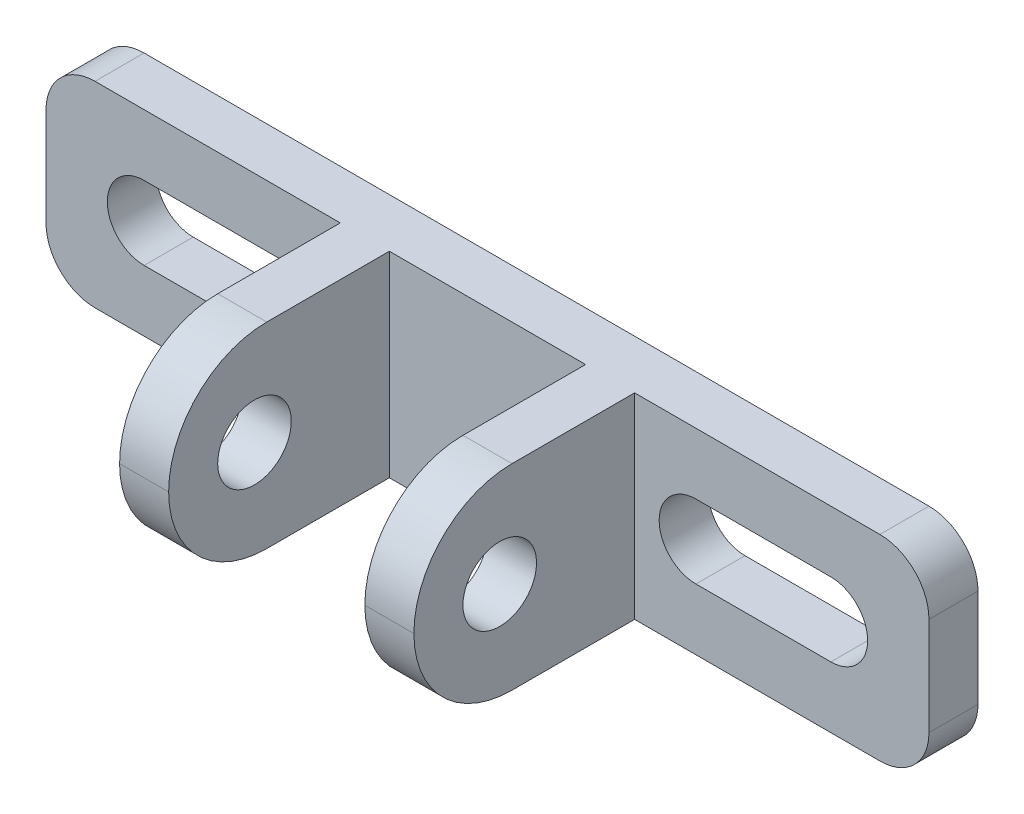
ISO-10303-21;
HEADER;
FILE_DESCRIPTION(('STEP AP214'),'2;1');
FILE_NAME('part.step','',(''),(''),'','','');
FILE_SCHEMA(('AUTOMOTIVE_DESIGN { 1 0 10303 214 1 1 1 1 }'));
ENDSEC;
DATA;
#1=APPLICATION_CONTEXT('core data for automotive mechanical design processes');
#2=APPLICATION_PROTOCOL_DEFINITION('international standard','automotive_design',2000,#1);
#3=PRODUCT_CONTEXT('',#1,'mechanical');
#4=PRODUCT('Part','Part','',(#3));
#5=PRODUCT_RELATED_PRODUCT_CATEGORY('part','',(#4));
#6=PRODUCT_DEFINITION_FORMATION('','',#4);
#7=PRODUCT_DEFINITION_CONTEXT('part definition',#1,'design');
#8=PRODUCT_DEFINITION('design','',#6,#7);
#9=PRODUCT_DEFINITION_SHAPE('','',#8);
#10=(LENGTH_UNIT() NAMED_UNIT(*) SI_UNIT(.MILLI.,.METRE.));
#11=(NAMED_UNIT(*) PLANE_ANGLE_UNIT() SI_UNIT($,.RADIAN.));
#12=(NAMED_UNIT(*) SI_UNIT($,.STERADIAN.) SOLID_ANGLE_UNIT());
#13=UNCERTAINTY_MEASURE_WITH_UNIT(LENGTH_MEASURE(1.E-05),#10,'distance_accuracy_value','');
#14=(GEOMETRIC_REPRESENTATION_CONTEXT(3) GLOBAL_UNCERTAINTY_ASSIGNED_CONTEXT((#13)) GLOBAL_UNIT_ASSIGNED_CONTEXT((#10,
#11,#12)) REPRESENTATION_CONTEXT('',''));
#15=CARTESIAN_POINT('',(0.,0.,0.));
#16=DIRECTION('',(0.,0.,1.));
#17=DIRECTION('',(1.,0.,0.));
#18=AXIS2_PLACEMENT_3D('',#15,#16,#17);
#19=CARTESIAN_POINT('',(36.,0.,11.));
#20=DIRECTION('',(1.,0.,0.));
#21=DIRECTION('',(0.,0.,-1.));
#22=AXIS2_PLACEMENT_3D('',#19,#20,#21);
#23=PLANE('',#22);
#24=DIRECTION('',(0.,-1.,0.));
#25=VECTOR('',#24,1.);
#26=CARTESIAN_POINT('',(36.,0.,0.));
#27=LINE('',#26,#25);
#28=CARTESIAN_POINT('',(36.,-2.,0.));
#29=VERTEX_POINT('',#28);
#30=CARTESIAN_POINT('',(36.,-6.,0.));
#31=VERTEX_POINT('',#30);
#32=EDGE_CURVE('E345',#29,#31,#27,.T.);
#33=ORIENTED_EDGE('',*,*,#32,.F.);
#34=DIRECTION('',(0.,0.,-1.));
#35=VECTOR('',#34,1.);
#36=CARTESIAN_POINT('',(36.,-2.,11.));
#37=LINE('',#36,#35);
#38=CARTESIAN_POINT('',(36.,-2.,2.));
#39=VERTEX_POINT('',#38);
#40=EDGE_CURVE('E402',#29,#39,#37,.F.);
#41=ORIENTED_EDGE('',*,*,#40,.T.);
#42=DIRECTION('',(0.,1.,0.));
#43=VECTOR('',#42,1.);
#44=CARTESIAN_POINT('',(36.,-8.,2.));
#45=LINE('',#44,#43);
#46=CARTESIAN_POINT('',(36.,-6.,2.));
#47=VERTEX_POINT('',#46);
#48=EDGE_CURVE('E292',#47,#39,#45,.T.);
#49=ORIENTED_EDGE('',*,*,#48,.F.);
#50=DIRECTION('',(0.,0.,-1.));
#51=VECTOR('',#50,1.);
#52=CARTESIAN_POINT('',(36.,-6.,0.));
#53=LINE('',#52,#51);
#54=EDGE_CURVE('E399',#47,#31,#53,.T.);
#55=ORIENTED_EDGE('',*,*,#54,.T.);
#56=EDGE_LOOP('',(#33,#41,#49,#55));
#57=FACE_BOUND('',#56,.T.);
#58=ADVANCED_FACE('F36',(#57),#23,.T.);
#59=CARTESIAN_POINT('',(0.,-8.,11.));
#60=DIRECTION('',(0.,1.,0.));
#61=DIRECTION('',(0.,0.,1.));
#62=AXIS2_PLACEMENT_3D('',#59,#60,#61);
#63=PLANE('',#62);
#64=DIRECTION('',(1.,0.,0.));
#65=VECTOR('',#64,1.);
#66=CARTESIAN_POINT('',(0.,-8.,0.));
#67=LINE('',#66,#65);
#68=CARTESIAN_POINT('',(2.,-8.,0.));
#69=VERTEX_POINT('',#68);
#70=CARTESIAN_POINT('',(34.,-8.,0.));
#71=VERTEX_POINT('',#70);
#72=EDGE_CURVE('E299',#69,#71,#67,.T.);
#73=ORIENTED_EDGE('',*,*,#72,.T.);
#74=DIRECTION('',(0.,0.,-1.));
#75=VECTOR('',#74,1.);
#76=CARTESIAN_POINT('',(34.,-8.,2.));
#77=LINE('',#76,#75);
#78=CARTESIAN_POINT('',(34.,-8.,2.));
#79=VERTEX_POINT('',#78);
#80=EDGE_CURVE('E411',#71,#79,#77,.F.);
#81=ORIENTED_EDGE('',*,*,#80,.T.);
#82=DIRECTION('',(1.,0.,0.));
#83=VECTOR('',#82,1.);
#84=CARTESIAN_POINT('',(24.,-8.,2.));
#85=LINE('',#84,#83);
#86=CARTESIAN_POINT('',(24.,-8.,2.));
#87=VERTEX_POINT('',#86);
#88=EDGE_CURVE('E289',#87,#79,#85,.T.);
#89=ORIENTED_EDGE('',*,*,#88,.F.);
#90=DIRECTION('',(0.,0.,1.));
#91=VECTOR('',#90,1.);
#92=CARTESIAN_POINT('',(24.,-8.,2.));
#93=LINE('',#92,#91);
#94=CARTESIAN_POINT('',(24.,-8.,7.));
#95=VERTEX_POINT('',#94);
#96=EDGE_CURVE('E296',#87,#95,#93,.T.);
#97=ORIENTED_EDGE('',*,*,#96,.T.);
#98=DIRECTION('',(1.,0.,0.));
#99=VECTOR('',#98,1.);
#100=CARTESIAN_POINT('',(0.,-8.,7.));
#101=LINE('',#100,#99);
#102=CARTESIAN_POINT('',(22.,-8.,7.));
#103=VERTEX_POINT('',#102);
#104=EDGE_CURVE('E360',#95,#103,#101,.F.);
#105=ORIENTED_EDGE('',*,*,#104,.T.);
#106=DIRECTION('',(0.,0.,1.));
#107=VECTOR('',#106,1.);
#108=CARTESIAN_POINT('',(22.,-8.,2.));
#109=LINE('',#108,#107);
#110=CARTESIAN_POINT('',(22.,-8.,2.));
#111=VERTEX_POINT('',#110);
#112=EDGE_CURVE('E306',#111,#103,#109,.T.);
#113=ORIENTED_EDGE('',*,*,#112,.F.);
#114=DIRECTION('',(1.,0.,0.));
#115=VECTOR('',#114,1.);
#116=CARTESIAN_POINT('',(14.,-8.,2.));
#117=LINE('',#116,#115);
#118=CARTESIAN_POINT('',(14.,-8.,2.));
#119=VERTEX_POINT('',#118);
#120=EDGE_CURVE('E329',#119,#111,#117,.T.);
#121=ORIENTED_EDGE('',*,*,#120,.F.);
#122=DIRECTION('',(0.,0.,1.));
#123=VECTOR('',#122,1.);
#124=CARTESIAN_POINT('',(14.,-8.,2.));
#125=LINE('',#124,#123);
#126=CARTESIAN_POINT('',(14.,-8.,7.));
#127=VERTEX_POINT('',#126);
#128=EDGE_CURVE('E335',#119,#127,#125,.T.);
#129=ORIENTED_EDGE('',*,*,#128,.T.);
#130=DIRECTION('',(1.,0.,0.));
#131=VECTOR('',#130,1.);
#132=CARTESIAN_POINT('',(0.,-8.,7.));
#133=LINE('',#132,#131);
#134=CARTESIAN_POINT('',(12.,-8.,7.));
#135=VERTEX_POINT('',#134);
#136=EDGE_CURVE('E358',#127,#135,#133,.F.);
#137=ORIENTED_EDGE('',*,*,#136,.T.);
#138=DIRECTION('',(0.,0.,1.));
#139=VECTOR('',#138,1.);
#140=CARTESIAN_POINT('',(12.,-8.,2.));
#141=LINE('',#140,#139);
#142=CARTESIAN_POINT('',(12.,-8.,2.));
#143=VERTEX_POINT('',#142);
#144=EDGE_CURVE('E314',#143,#135,#141,.T.);
#145=ORIENTED_EDGE('',*,*,#144,.F.);
#146=DIRECTION('',(1.,0.,0.));
#147=VECTOR('',#146,1.);
#148=CARTESIAN_POINT('',(12.,-8.,2.));
#149=LINE('',#148,#147);
#150=CARTESIAN_POINT('',(2.,-8.,2.));
#151=VERTEX_POINT('',#150);
#152=EDGE_CURVE('E309',#151,#143,#149,.T.);
#153=ORIENTED_EDGE('',*,*,#152,.F.);
#154=DIRECTION('',(0.,0.,-1.));
#155=VECTOR('',#154,1.);
#156=CARTESIAN_POINT('',(2.,-8.,11.));
#157=LINE('',#156,#155);
#158=EDGE_CURVE('E408',#151,#69,#157,.T.);
#159=ORIENTED_EDGE('',*,*,#158,.T.);
#160=EDGE_LOOP('',(#73,#81,#89,#97,#105,#113,#121,#129,#137,#145,#153,#159));
#161=FACE_BOUND('',#160,.T.);
#162=ADVANCED_FACE('F452',(#161),#63,.F.);
#163=CARTESIAN_POINT('',(0.,0.,11.));
#164=DIRECTION('',(0.,1.,0.));
#165=DIRECTION('',(0.,0.,1.));
#166=AXIS2_PLACEMENT_3D('',#163,#164,#165);
#167=PLANE('',#166);
#168=DIRECTION('',(-1.,0.,0.));
#169=VECTOR('',#168,1.);
#170=CARTESIAN_POINT('',(36.,0.,2.));
#171=LINE('',#170,#169);
#172=CARTESIAN_POINT('',(34.,0.,2.));
#173=VERTEX_POINT('',#172);
#174=CARTESIAN_POINT('',(24.,0.,2.));
#175=VERTEX_POINT('',#174);
#176=EDGE_CURVE('E283',#173,#175,#171,.T.);
#177=ORIENTED_EDGE('',*,*,#176,.F.);
#178=DIRECTION('',(0.,0.,-1.));
#179=VECTOR('',#178,1.);
#180=CARTESIAN_POINT('',(34.,0.,11.));
#181=LINE('',#180,#179);
#182=CARTESIAN_POINT('',(34.,0.,0.));
#183=VERTEX_POINT('',#182);
#184=EDGE_CURVE('E388',#173,#183,#181,.T.);
#185=ORIENTED_EDGE('',*,*,#184,.T.);
#186=DIRECTION('',(1.,0.,0.));
#187=VECTOR('',#186,1.);
#188=CARTESIAN_POINT('',(0.,0.,0.));
#189=LINE('',#188,#187);
#190=CARTESIAN_POINT('',(2.,0.,0.));
#191=VERTEX_POINT('',#190);
#192=EDGE_CURVE('E348',#191,#183,#189,.T.);
#193=ORIENTED_EDGE('',*,*,#192,.F.);
#194=DIRECTION('',(0.,0.,-1.));
#195=VECTOR('',#194,1.);
#196=CARTESIAN_POINT('',(2.,0.,2.));
#197=LINE('',#196,#195);
#198=CARTESIAN_POINT('',(2.,0.,2.));
#199=VERTEX_POINT('',#198);
#200=EDGE_CURVE('E380',#191,#199,#197,.F.);
#201=ORIENTED_EDGE('',*,*,#200,.T.);
#202=DIRECTION('',(-1.,0.,0.));
#203=VECTOR('',#202,1.);
#204=CARTESIAN_POINT('',(0.,0.,2.));
#205=LINE('',#204,#203);
#206=CARTESIAN_POINT('',(12.,0.,2.));
#207=VERTEX_POINT('',#206);
#208=EDGE_CURVE('E302',#207,#199,#205,.T.);
#209=ORIENTED_EDGE('',*,*,#208,.F.);
#210=DIRECTION('',(0.,0.,1.));
#211=VECTOR('',#210,1.);
#212=CARTESIAN_POINT('',(12.,0.,2.));
#213=LINE('',#212,#211);
#214=CARTESIAN_POINT('',(12.,0.,7.));
#215=VERTEX_POINT('',#214);
#216=EDGE_CURVE('E286',#207,#215,#213,.T.);
#217=ORIENTED_EDGE('',*,*,#216,.T.);
#218=DIRECTION('',(1.,0.,0.));
#219=VECTOR('',#218,1.);
#220=CARTESIAN_POINT('',(14.,0.,7.));
#221=LINE('',#220,#219);
#222=CARTESIAN_POINT('',(14.,0.,7.));
#223=VERTEX_POINT('',#222);
#224=EDGE_CURVE('E367',#215,#223,#221,.T.);
#225=ORIENTED_EDGE('',*,*,#224,.T.);
#226=DIRECTION('',(0.,0.,1.));
#227=VECTOR('',#226,1.);
#228=CARTESIAN_POINT('',(14.,0.,2.));
#229=LINE('',#228,#227);
#230=CARTESIAN_POINT('',(14.,0.,2.));
#231=VERTEX_POINT('',#230);
#232=EDGE_CURVE('E338',#231,#223,#229,.T.);
#233=ORIENTED_EDGE('',*,*,#232,.F.);
#234=DIRECTION('',(-1.,0.,0.));
#235=VECTOR('',#234,1.);
#236=CARTESIAN_POINT('',(22.,0.,2.));
#237=LINE('',#236,#235);
#238=CARTESIAN_POINT('',(22.,0.,2.));
#239=VERTEX_POINT('',#238);
#240=EDGE_CURVE('E322',#239,#231,#237,.T.);
#241=ORIENTED_EDGE('',*,*,#240,.F.);
#242=DIRECTION('',(0.,0.,1.));
#243=VECTOR('',#242,1.);
#244=CARTESIAN_POINT('',(22.,0.,2.));
#245=LINE('',#244,#243);
#246=CARTESIAN_POINT('',(22.,0.,7.));
#247=VERTEX_POINT('',#246);
#248=EDGE_CURVE('E332',#239,#247,#245,.T.);
#249=ORIENTED_EDGE('',*,*,#248,.T.);
#250=DIRECTION('',(1.,0.,0.));
#251=VECTOR('',#250,1.);
#252=CARTESIAN_POINT('',(24.,0.,7.));
#253=LINE('',#252,#251);
#254=CARTESIAN_POINT('',(24.,0.,7.));
#255=VERTEX_POINT('',#254);
#256=EDGE_CURVE('E370',#247,#255,#253,.T.);
#257=ORIENTED_EDGE('',*,*,#256,.T.);
#258=DIRECTION('',(0.,0.,1.));
#259=VECTOR('',#258,1.);
#260=CARTESIAN_POINT('',(24.,0.,2.));
#261=LINE('',#260,#259);
#262=EDGE_CURVE('E295',#175,#255,#261,.T.);
#263=ORIENTED_EDGE('',*,*,#262,.F.);
#264=EDGE_LOOP('',(#177,#185,#193,#201,#209,#217,#225,#233,#241,#249,#257,#263));
#265=FACE_BOUND('',#264,.T.);
#266=ADVANCED_FACE('F435',(#265),#167,.T.);
#267=CARTESIAN_POINT('',(0.,0.,11.));
#268=DIRECTION('',(1.,0.,0.));
#269=DIRECTION('',(0.,1.,0.));
#270=AXIS2_PLACEMENT_3D('',#267,#268,#269);
#271=PLANE('',#270);
#272=DIRECTION('',(0.,-1.,0.));
#273=VECTOR('',#272,1.);
#274=CARTESIAN_POINT('',(0.,0.,0.));
#275=LINE('',#274,#273);
#276=CARTESIAN_POINT('',(0.,-2.,0.));
#277=VERTEX_POINT('',#276);
#278=CARTESIAN_POINT('',(0.,-6.,0.));
#279=VERTEX_POINT('',#278);
#280=EDGE_CURVE('E351',#277,#279,#275,.T.);
#281=ORIENTED_EDGE('',*,*,#280,.T.);
#282=DIRECTION('',(0.,0.,-1.));
#283=VECTOR('',#282,1.);
#284=CARTESIAN_POINT('',(0.,-6.,11.));
#285=LINE('',#284,#283);
#286=CARTESIAN_POINT('',(0.,-6.,2.));
#287=VERTEX_POINT('',#286);
#288=EDGE_CURVE('E416',#279,#287,#285,.F.);
#289=ORIENTED_EDGE('',*,*,#288,.T.);
#290=DIRECTION('',(0.,-1.,0.));
#291=VECTOR('',#290,1.);
#292=CARTESIAN_POINT('',(0.,-8.,2.));
#293=LINE('',#292,#291);
#294=CARTESIAN_POINT('',(0.,-2.,2.));
#295=VERTEX_POINT('',#294);
#296=EDGE_CURVE('E305',#295,#287,#293,.T.);
#297=ORIENTED_EDGE('',*,*,#296,.F.);
#298=DIRECTION('',(0.,0.,-1.));
#299=VECTOR('',#298,1.);
#300=CARTESIAN_POINT('',(0.,-2.,0.));
#301=LINE('',#300,#299);
#302=EDGE_CURVE('E413',#295,#277,#301,.T.);
#303=ORIENTED_EDGE('',*,*,#302,.T.);
#304=EDGE_LOOP('',(#281,#289,#297,#303));
#305=FACE_BOUND('',#304,.T.);
#306=ADVANCED_FACE('F427',(#305),#271,.F.);
#307=CARTESIAN_POINT('',(0.,0.,0.));
#308=DIRECTION('',(0.,0.,-1.));
#309=DIRECTION('',(-1.,0.,0.));
#310=AXIS2_PLACEMENT_3D('',#307,#308,#309);
#311=PLANE('',#310);
#312=CARTESIAN_POINT('',(32.,-4.,0.));
#313=DIRECTION('',(0.,0.,-1.));
#314=DIRECTION('',(-1.,0.,0.));
#315=AXIS2_PLACEMENT_3D('',#312,#313,#314);
#316=CIRCLE('',#315,1.5);
#317=CARTESIAN_POINT('',(32.,-2.5,0.));
#318=VERTEX_POINT('',#317);
#319=CARTESIAN_POINT('',(32.,-5.5,0.));
#320=VERTEX_POINT('',#319);
#321=EDGE_CURVE('E262',#318,#320,#316,.T.);
#322=ORIENTED_EDGE('',*,*,#321,.F.);
#323=DIRECTION('',(1.,0.,0.));
#324=VECTOR('',#323,1.);
#325=CARTESIAN_POINT('',(0.,-2.5,0.));
#326=LINE('',#325,#324);
#327=CARTESIAN_POINT('',(26.5,-2.5,0.));
#328=VERTEX_POINT('',#327);
#329=EDGE_CURVE('E237',#328,#318,#326,.T.);
#330=ORIENTED_EDGE('',*,*,#329,.F.);
#331=CARTESIAN_POINT('',(26.5,-4.,0.));
#332=DIRECTION('',(0.,0.,-1.));
#333=DIRECTION('',(-1.,0.,0.));
#334=AXIS2_PLACEMENT_3D('',#331,#332,#333);
#335=CIRCLE('',#334,1.5);
#336=CARTESIAN_POINT('',(26.5,-5.5,0.));
#337=VERTEX_POINT('',#336);
#338=EDGE_CURVE('E213',#337,#328,#335,.T.);
#339=ORIENTED_EDGE('',*,*,#338,.F.);
#340=DIRECTION('',(-1.,0.,0.));
#341=VECTOR('',#340,1.);
#342=CARTESIAN_POINT('',(0.,-5.5,0.));
#343=LINE('',#342,#341);
#344=EDGE_CURVE('E260',#320,#337,#343,.T.);
#345=ORIENTED_EDGE('',*,*,#344,.F.);
#346=EDGE_LOOP('',(#322,#330,#339,#345));
#347=FACE_BOUND('',#346,.T.);
#348=CARTESIAN_POINT('',(4.,-4.,0.));
#349=DIRECTION('',(0.,0.,-1.));
#350=DIRECTION('',(-1.,0.,0.));
#351=AXIS2_PLACEMENT_3D('',#348,#349,#350);
#352=CIRCLE('',#351,1.5);
#353=CARTESIAN_POINT('',(4.,-5.5,0.));
#354=VERTEX_POINT('',#353);
#355=CARTESIAN_POINT('',(4.,-2.5,0.));
#356=VERTEX_POINT('',#355);
#357=EDGE_CURVE('E270',#354,#356,#352,.T.);
#358=ORIENTED_EDGE('',*,*,#357,.F.);
#359=DIRECTION('',(-1.,0.,0.));
#360=VECTOR('',#359,1.);
#361=CARTESIAN_POINT('',(0.,-5.5,0.));
#362=LINE('',#361,#360);
#363=CARTESIAN_POINT('',(9.5,-5.5,0.));
#364=VERTEX_POINT('',#363);
#365=EDGE_CURVE('E264',#364,#354,#362,.T.);
#366=ORIENTED_EDGE('',*,*,#365,.F.);
#367=CARTESIAN_POINT('',(9.5,-4.,0.));
#368=DIRECTION('',(0.,0.,-1.));
#369=DIRECTION('',(-1.,0.,0.));
#370=AXIS2_PLACEMENT_3D('',#367,#368,#369);
#371=CIRCLE('',#370,1.5);
#372=CARTESIAN_POINT('',(9.5,-2.5,0.));
#373=VERTEX_POINT('',#372);
#374=EDGE_CURVE('E266',#373,#364,#371,.T.);
#375=ORIENTED_EDGE('',*,*,#374,.F.);
#376=DIRECTION('',(1.,0.,0.));
#377=VECTOR('',#376,1.);
#378=CARTESIAN_POINT('',(0.,-2.5,0.));
#379=LINE('',#378,#377);
#380=EDGE_CURVE('E268',#356,#373,#379,.T.);
#381=ORIENTED_EDGE('',*,*,#380,.F.);
#382=EDGE_LOOP('',(#358,#366,#375,#381));
#383=FACE_BOUND('',#382,.T.);
#384=ORIENTED_EDGE('',*,*,#192,.T.);
#385=CARTESIAN_POINT('',(34.,-2.,0.));
#386=DIRECTION('',(0.,0.,-1.));
#387=DIRECTION('',(-1.,0.,0.));
#388=AXIS2_PLACEMENT_3D('',#385,#386,#387);
#389=CIRCLE('',#388,2.);
#390=EDGE_CURVE('E397',#183,#29,#389,.T.);
#391=ORIENTED_EDGE('',*,*,#390,.T.);
#392=ORIENTED_EDGE('',*,*,#32,.T.);
#393=CARTESIAN_POINT('',(34.,-6.,0.));
#394=DIRECTION('',(0.,0.,-1.));
#395=DIRECTION('',(-1.,0.,0.));
#396=AXIS2_PLACEMENT_3D('',#393,#394,#395);
#397=CIRCLE('',#396,2.);
#398=EDGE_CURVE('E395',#31,#71,#397,.T.);
#399=ORIENTED_EDGE('',*,*,#398,.T.);
#400=ORIENTED_EDGE('',*,*,#72,.F.);
#401=CARTESIAN_POINT('',(2.,-6.,0.));
#402=DIRECTION('',(0.,0.,-1.));
#403=DIRECTION('',(-1.,0.,0.));
#404=AXIS2_PLACEMENT_3D('',#401,#402,#403);
#405=CIRCLE('',#404,2.);
#406=EDGE_CURVE('E393',#69,#279,#405,.T.);
#407=ORIENTED_EDGE('',*,*,#406,.T.);
#408=ORIENTED_EDGE('',*,*,#280,.F.);
#409=CARTESIAN_POINT('',(2.,-2.,0.));
#410=DIRECTION('',(0.,0.,-1.));
#411=DIRECTION('',(-1.,0.,0.));
#412=AXIS2_PLACEMENT_3D('',#409,#410,#411);
#413=CIRCLE('',#412,2.);
#414=EDGE_CURVE('E391',#277,#191,#413,.T.);
#415=ORIENTED_EDGE('',*,*,#414,.T.);
#416=EDGE_LOOP('',(#384,#391,#392,#399,#400,#407,#408,#415));
#417=FACE_BOUND('',#416,.T.);
#418=ADVANCED_FACE('F432',(#347,#383,#417),#311,.T.);
#419=CARTESIAN_POINT('',(22.,-8.,2.));
#420=DIRECTION('',(1.,0.,0.));
#421=DIRECTION('',(0.,0.,-1.));
#422=AXIS2_PLACEMENT_3D('',#419,#420,#421);
#423=PLANE('',#422);
#424=CARTESIAN_POINT('',(22.,-4.,7.5));
#425=DIRECTION('',(1.,0.,0.));
#426=DIRECTION('',(0.,0.,-1.));
#427=AXIS2_PLACEMENT_3D('',#424,#425,#426);
#428=CIRCLE('',#427,1.5);
#429=CARTESIAN_POINT('',(22.,-4.,6.));
#430=VERTEX_POINT('',#429);
#431=EDGE_CURVE('E279',#430,#430,#428,.T.);
#432=ORIENTED_EDGE('',*,*,#431,.T.);
#433=EDGE_LOOP('',(#432));
#434=FACE_BOUND('',#433,.T.);
#435=ORIENTED_EDGE('',*,*,#112,.T.);
#436=CARTESIAN_POINT('',(22.,-4.,7.));
#437=DIRECTION('',(1.,0.,0.));
#438=DIRECTION('',(0.,0.,-1.));
#439=AXIS2_PLACEMENT_3D('',#436,#437,#438);
#440=CIRCLE('',#439,4.);
#441=CARTESIAN_POINT('',(22.,-4.,11.));
#442=VERTEX_POINT('',#441);
#443=EDGE_CURVE('E365',#103,#442,#440,.F.);
#444=ORIENTED_EDGE('',*,*,#443,.T.);
#445=CARTESIAN_POINT('',(22.,-4.,7.));
#446=DIRECTION('',(1.,0.,0.));
#447=DIRECTION('',(0.,0.,-1.));
#448=AXIS2_PLACEMENT_3D('',#445,#446,#447);
#449=CIRCLE('',#448,4.);
#450=EDGE_CURVE('E363',#442,#247,#449,.F.);
#451=ORIENTED_EDGE('',*,*,#450,.T.);
#452=ORIENTED_EDGE('',*,*,#248,.F.);
#453=DIRECTION('',(0.,1.,0.));
#454=VECTOR('',#453,1.);
#455=CARTESIAN_POINT('',(22.,-8.,2.));
#456=LINE('',#455,#454);
#457=EDGE_CURVE('E319',#111,#239,#456,.T.);
#458=ORIENTED_EDGE('',*,*,#457,.F.);
#459=EDGE_LOOP('',(#435,#444,#451,#452,#458));
#460=FACE_BOUND('',#459,.T.);
#461=ADVANCED_FACE('F482',(#434,#460),#423,.F.);
#462=CARTESIAN_POINT('',(14.,0.,2.));
#463=DIRECTION('',(-1.,0.,0.));
#464=DIRECTION('',(0.,0.,1.));
#465=AXIS2_PLACEMENT_3D('',#462,#463,#464);
#466=PLANE('',#465);
#467=CARTESIAN_POINT('',(14.,-4.,7.5));
#468=DIRECTION('',(-1.,0.,0.));
#469=DIRECTION('',(0.,0.,1.));
#470=AXIS2_PLACEMENT_3D('',#467,#468,#469);
#471=CIRCLE('',#470,1.5);
#472=CARTESIAN_POINT('',(14.,-4.,9.));
#473=VERTEX_POINT('',#472);
#474=EDGE_CURVE('E276',#473,#473,#471,.T.);
#475=ORIENTED_EDGE('',*,*,#474,.T.);
#476=EDGE_LOOP('',(#475));
#477=FACE_BOUND('',#476,.T.);
#478=ORIENTED_EDGE('',*,*,#232,.T.);
#479=CARTESIAN_POINT('',(14.,-4.,7.));
#480=DIRECTION('',(-1.,0.,0.));
#481=DIRECTION('',(0.,0.,1.));
#482=AXIS2_PLACEMENT_3D('',#479,#480,#481);
#483=CIRCLE('',#482,4.);
#484=CARTESIAN_POINT('',(14.,-4.,11.));
#485=VERTEX_POINT('',#484);
#486=EDGE_CURVE('E374',#223,#485,#483,.F.);
#487=ORIENTED_EDGE('',*,*,#486,.T.);
#488=CARTESIAN_POINT('',(14.,-4.,7.));
#489=DIRECTION('',(-1.,0.,0.));
#490=DIRECTION('',(0.,0.,1.));
#491=AXIS2_PLACEMENT_3D('',#488,#489,#490);
#492=CIRCLE('',#491,4.);
#493=EDGE_CURVE('E372',#485,#127,#492,.F.);
#494=ORIENTED_EDGE('',*,*,#493,.T.);
#495=ORIENTED_EDGE('',*,*,#128,.F.);
#496=DIRECTION('',(0.,-1.,0.));
#497=VECTOR('',#496,1.);
#498=CARTESIAN_POINT('',(14.,0.,2.));
#499=LINE('',#498,#497);
#500=EDGE_CURVE('E326',#231,#119,#499,.T.);
#501=ORIENTED_EDGE('',*,*,#500,.F.);
#502=EDGE_LOOP('',(#478,#487,#494,#495,#501));
#503=FACE_BOUND('',#502,.T.);
#504=ADVANCED_FACE('F475',(#477,#503),#466,.F.);
#505=CARTESIAN_POINT('',(0.,0.,2.));
#506=DIRECTION('',(0.,0.,1.));
#507=DIRECTION('',(1.,0.,0.));
#508=AXIS2_PLACEMENT_3D('',#505,#506,#507);
#509=PLANE('',#508);
#510=ORIENTED_EDGE('',*,*,#457,.T.);
#511=ORIENTED_EDGE('',*,*,#240,.T.);
#512=ORIENTED_EDGE('',*,*,#500,.T.);
#513=ORIENTED_EDGE('',*,*,#120,.T.);
#514=EDGE_LOOP('',(#510,#511,#512,#513));
#515=FACE_BOUND('',#514,.T.);
#516=ADVANCED_FACE('F479',(#515),#509,.T.);
#517=CARTESIAN_POINT('',(12.,0.,2.));
#518=DIRECTION('',(1.,0.,0.));
#519=DIRECTION('',(0.,0.,-1.));
#520=AXIS2_PLACEMENT_3D('',#517,#518,#519);
#521=PLANE('',#520);
#522=CARTESIAN_POINT('',(12.,-4.,7.5));
#523=DIRECTION('',(1.,0.,0.));
#524=DIRECTION('',(0.,0.,-1.));
#525=AXIS2_PLACEMENT_3D('',#522,#523,#524);
#526=CIRCLE('',#525,1.5);
#527=CARTESIAN_POINT('',(12.,-4.,6.));
#528=VERTEX_POINT('',#527);
#529=EDGE_CURVE('E273',#528,#528,#526,.T.);
#530=ORIENTED_EDGE('',*,*,#529,.T.);
#531=EDGE_LOOP('',(#530));
#532=FACE_BOUND('',#531,.T.);
#533=CARTESIAN_POINT('',(12.,-4.,7.));
#534=DIRECTION('',(1.,0.,0.));
#535=DIRECTION('',(0.,0.,-1.));
#536=AXIS2_PLACEMENT_3D('',#533,#534,#535);
#537=CIRCLE('',#536,4.);
#538=CARTESIAN_POINT('',(12.,-4.,11.));
#539=VERTEX_POINT('',#538);
#540=EDGE_CURVE('E376',#135,#539,#537,.F.);
#541=ORIENTED_EDGE('',*,*,#540,.T.);
#542=CARTESIAN_POINT('',(12.,-4.,7.));
#543=DIRECTION('',(1.,0.,0.));
#544=DIRECTION('',(0.,0.,-1.));
#545=AXIS2_PLACEMENT_3D('',#542,#543,#544);
#546=CIRCLE('',#545,4.);
#547=EDGE_CURVE('E378',#539,#215,#546,.F.);
#548=ORIENTED_EDGE('',*,*,#547,.T.);
#549=ORIENTED_EDGE('',*,*,#216,.F.);
#550=DIRECTION('',(0.,1.,0.));
#551=VECTOR('',#550,1.);
#552=CARTESIAN_POINT('',(12.,0.,2.));
#553=LINE('',#552,#551);
#554=EDGE_CURVE('E311',#143,#207,#553,.T.);
#555=ORIENTED_EDGE('',*,*,#554,.F.);
#556=ORIENTED_EDGE('',*,*,#144,.T.);
#557=EDGE_LOOP('',(#541,#548,#549,#555,#556));
#558=FACE_BOUND('',#557,.T.);
#559=ADVANCED_FACE('F461',(#532,#558),#521,.F.);
#560=CARTESIAN_POINT('',(0.,0.,2.));
#561=DIRECTION('',(0.,0.,-1.));
#562=DIRECTION('',(-1.,0.,0.));
#563=AXIS2_PLACEMENT_3D('',#560,#561,#562);
#564=PLANE('',#563);
#565=DIRECTION('',(1.,0.,0.));
#566=VECTOR('',#565,1.);
#567=CARTESIAN_POINT('',(4.,-5.5,2.));
#568=LINE('',#567,#566);
#569=CARTESIAN_POINT('',(4.,-5.5,2.));
#570=VERTEX_POINT('',#569);
#571=CARTESIAN_POINT('',(9.5,-5.5,2.));
#572=VERTEX_POINT('',#571);
#573=EDGE_CURVE('E242',#570,#572,#568,.T.);
#574=ORIENTED_EDGE('',*,*,#573,.F.);
#575=CARTESIAN_POINT('',(4.,-4.,2.));
#576=DIRECTION('',(0.,0.,1.));
#577=DIRECTION('',(1.,0.,0.));
#578=AXIS2_PLACEMENT_3D('',#575,#576,#577);
#579=CIRCLE('',#578,1.5);
#580=CARTESIAN_POINT('',(4.,-2.5,2.));
#581=VERTEX_POINT('',#580);
#582=EDGE_CURVE('E240',#581,#570,#579,.T.);
#583=ORIENTED_EDGE('',*,*,#582,.F.);
#584=DIRECTION('',(-1.,0.,0.));
#585=VECTOR('',#584,1.);
#586=CARTESIAN_POINT('',(4.,-2.5,2.));
#587=LINE('',#586,#585);
#588=CARTESIAN_POINT('',(9.5,-2.5,2.));
#589=VERTEX_POINT('',#588);
#590=EDGE_CURVE('E247',#589,#581,#587,.T.);
#591=ORIENTED_EDGE('',*,*,#590,.F.);
#592=CARTESIAN_POINT('',(9.5,-4.,2.));
#593=DIRECTION('',(0.,0.,1.));
#594=DIRECTION('',(1.,0.,0.));
#595=AXIS2_PLACEMENT_3D('',#592,#593,#594);
#596=CIRCLE('',#595,1.5);
#597=EDGE_CURVE('E244',#572,#589,#596,.T.);
#598=ORIENTED_EDGE('',*,*,#597,.F.);
#599=EDGE_LOOP('',(#574,#583,#591,#598));
#600=FACE_BOUND('',#599,.T.);
#601=ORIENTED_EDGE('',*,*,#296,.T.);
#602=CARTESIAN_POINT('',(2.,-6.,2.));
#603=DIRECTION('',(0.,0.,-1.));
#604=DIRECTION('',(-1.,0.,0.));
#605=AXIS2_PLACEMENT_3D('',#602,#603,#604);
#606=CIRCLE('',#605,2.);
#607=EDGE_CURVE('E11',#287,#151,#606,.F.);
#608=ORIENTED_EDGE('',*,*,#607,.T.);
#609=ORIENTED_EDGE('',*,*,#152,.T.);
#610=ORIENTED_EDGE('',*,*,#554,.T.);
#611=ORIENTED_EDGE('',*,*,#208,.T.);
#612=CARTESIAN_POINT('',(2.,-2.,2.));
#613=DIRECTION('',(0.,0.,-1.));
#614=DIRECTION('',(-1.,0.,0.));
#615=AXIS2_PLACEMENT_3D('',#612,#613,#614);
#616=CIRCLE('',#615,2.);
#617=EDGE_CURVE('E44',#199,#295,#616,.F.);
#618=ORIENTED_EDGE('',*,*,#617,.T.);
#619=EDGE_LOOP('',(#601,#608,#609,#610,#611,#618));
#620=FACE_BOUND('',#619,.T.);
#621=ADVANCED_FACE('F420',(#600,#620),#564,.F.);
#622=CARTESIAN_POINT('',(24.,0.,2.));
#623=DIRECTION('',(-1.,0.,0.));
#624=DIRECTION('',(0.,0.,1.));
#625=AXIS2_PLACEMENT_3D('',#622,#623,#624);
#626=PLANE('',#625);
#627=CARTESIAN_POINT('',(24.,-4.,7.5));
#628=DIRECTION('',(-1.,0.,0.));
#629=DIRECTION('',(0.,0.,1.));
#630=AXIS2_PLACEMENT_3D('',#627,#628,#629);
#631=CIRCLE('',#630,1.5);
#632=CARTESIAN_POINT('',(24.,-4.,9.));
#633=VERTEX_POINT('',#632);
#634=EDGE_CURVE('E272',#633,#633,#631,.T.);
#635=ORIENTED_EDGE('',*,*,#634,.T.);
#636=EDGE_LOOP('',(#635));
#637=FACE_BOUND('',#636,.T.);
#638=CARTESIAN_POINT('',(24.,-4.,7.));
#639=DIRECTION('',(-1.,0.,0.));
#640=DIRECTION('',(0.,0.,1.));
#641=AXIS2_PLACEMENT_3D('',#638,#639,#640);
#642=CIRCLE('',#641,4.);
#643=CARTESIAN_POINT('',(24.,-4.,11.));
#644=VERTEX_POINT('',#643);
#645=EDGE_CURVE('E354',#255,#644,#642,.F.);
#646=ORIENTED_EDGE('',*,*,#645,.T.);
#647=CARTESIAN_POINT('',(24.,-4.,7.));
#648=DIRECTION('',(-1.,0.,0.));
#649=DIRECTION('',(0.,0.,1.));
#650=AXIS2_PLACEMENT_3D('',#647,#648,#649);
#651=CIRCLE('',#650,4.);
#652=EDGE_CURVE('E356',#644,#95,#651,.F.);
#653=ORIENTED_EDGE('',*,*,#652,.T.);
#654=ORIENTED_EDGE('',*,*,#96,.F.);
#655=DIRECTION('',(0.,-1.,0.));
#656=VECTOR('',#655,1.);
#657=CARTESIAN_POINT('',(24.,0.,2.));
#658=LINE('',#657,#656);
#659=EDGE_CURVE('E285',#175,#87,#658,.T.);
#660=ORIENTED_EDGE('',*,*,#659,.F.);
#661=ORIENTED_EDGE('',*,*,#262,.T.);
#662=EDGE_LOOP('',(#646,#653,#654,#660,#661));
#663=FACE_BOUND('',#662,.T.);
#664=ADVANCED_FACE('F493',(#637,#663),#626,.F.);
#665=CARTESIAN_POINT('',(0.,0.,2.));
#666=DIRECTION('',(0.,0.,1.));
#667=DIRECTION('',(1.,0.,0.));
#668=AXIS2_PLACEMENT_3D('',#665,#666,#667);
#669=PLANE('',#668);
#670=CARTESIAN_POINT('',(32.,-4.,2.));
#671=DIRECTION('',(0.,0.,1.));
#672=DIRECTION('',(-1.,0.,0.));
#673=AXIS2_PLACEMENT_3D('',#670,#671,#672);
#674=CIRCLE('',#673,1.5);
#675=CARTESIAN_POINT('',(32.,-5.5,2.));
#676=VERTEX_POINT('',#675);
#677=CARTESIAN_POINT('',(32.,-2.5,2.));
#678=VERTEX_POINT('',#677);
#679=EDGE_CURVE('E225',#676,#678,#674,.T.);
#680=ORIENTED_EDGE('',*,*,#679,.F.);
#681=DIRECTION('',(1.,0.,0.));
#682=VECTOR('',#681,1.);
#683=CARTESIAN_POINT('',(32.,-5.5,2.));
#684=LINE('',#683,#682);
#685=CARTESIAN_POINT('',(26.5,-5.5,2.));
#686=VERTEX_POINT('',#685);
#687=EDGE_CURVE('E230',#686,#676,#684,.T.);
#688=ORIENTED_EDGE('',*,*,#687,.F.);
#689=CARTESIAN_POINT('',(26.5,-4.,2.));
#690=DIRECTION('',(0.,0.,1.));
#691=DIRECTION('',(-1.,0.,0.));
#692=AXIS2_PLACEMENT_3D('',#689,#690,#691);
#693=CIRCLE('',#692,1.5);
#694=CARTESIAN_POINT('',(26.5,-2.5,2.));
#695=VERTEX_POINT('',#694);
#696=EDGE_CURVE('E210',#695,#686,#693,.T.);
#697=ORIENTED_EDGE('',*,*,#696,.F.);
#698=DIRECTION('',(-1.,0.,0.));
#699=VECTOR('',#698,1.);
#700=CARTESIAN_POINT('',(32.,-2.5,2.));
#701=LINE('',#700,#699);
#702=EDGE_CURVE('E220',#678,#695,#701,.T.);
#703=ORIENTED_EDGE('',*,*,#702,.F.);
#704=EDGE_LOOP('',(#680,#688,#697,#703));
#705=FACE_BOUND('',#704,.T.);
#706=ORIENTED_EDGE('',*,*,#48,.T.);
#707=CARTESIAN_POINT('',(34.,-2.,2.));
#708=DIRECTION('',(0.,0.,1.));
#709=DIRECTION('',(1.,0.,0.));
#710=AXIS2_PLACEMENT_3D('',#707,#708,#709);
#711=CIRCLE('',#710,2.);
#712=EDGE_CURVE('E406',#39,#173,#711,.T.);
#713=ORIENTED_EDGE('',*,*,#712,.T.);
#714=ORIENTED_EDGE('',*,*,#176,.T.);
#715=ORIENTED_EDGE('',*,*,#659,.T.);
#716=ORIENTED_EDGE('',*,*,#88,.T.);
#717=CARTESIAN_POINT('',(34.,-6.,2.));
#718=DIRECTION('',(0.,0.,1.));
#719=DIRECTION('',(1.,0.,0.));
#720=AXIS2_PLACEMENT_3D('',#717,#718,#719);
#721=CIRCLE('',#720,2.);
#722=EDGE_CURVE('E404',#79,#47,#721,.T.);
#723=ORIENTED_EDGE('',*,*,#722,.T.);
#724=EDGE_LOOP('',(#706,#713,#714,#715,#716,#723));
#725=FACE_BOUND('',#724,.T.);
#726=ADVANCED_FACE('F227',(#705,#725),#669,.T.);
#727=CARTESIAN_POINT('',(0.,-4.,7.));
#728=DIRECTION('',(-1.,0.,0.));
#729=DIRECTION('',(0.,0.,1.));
#730=AXIS2_PLACEMENT_3D('',#727,#728,#729);
#731=CYLINDRICAL_SURFACE('',#730,4.);
#732=ORIENTED_EDGE('',*,*,#256,.F.);
#733=ORIENTED_EDGE('',*,*,#450,.F.);
#734=DIRECTION('',(1.,0.,0.));
#735=VECTOR('',#734,1.);
#736=CARTESIAN_POINT('',(22.,-4.,11.));
#737=LINE('',#736,#735);
#738=EDGE_CURVE('E323',#644,#442,#737,.F.);
#739=ORIENTED_EDGE('',*,*,#738,.F.);
#740=ORIENTED_EDGE('',*,*,#645,.F.);
#741=EDGE_LOOP('',(#732,#733,#739,#740));
#742=FACE_BOUND('',#741,.T.);
#743=ADVANCED_FACE('F486',(#742),#731,.T.);
#744=CARTESIAN_POINT('',(0.,-4.,7.));
#745=DIRECTION('',(1.,0.,0.));
#746=DIRECTION('',(0.,0.,-1.));
#747=AXIS2_PLACEMENT_3D('',#744,#745,#746);
#748=CYLINDRICAL_SURFACE('',#747,4.);
#749=ORIENTED_EDGE('',*,*,#443,.F.);
#750=ORIENTED_EDGE('',*,*,#104,.F.);
#751=ORIENTED_EDGE('',*,*,#652,.F.);
#752=ORIENTED_EDGE('',*,*,#738,.T.);
#753=EDGE_LOOP('',(#749,#750,#751,#752));
#754=FACE_BOUND('',#753,.T.);
#755=ADVANCED_FACE('F490',(#754),#748,.T.);
#756=CARTESIAN_POINT('',(0.,-4.,7.));
#757=DIRECTION('',(1.,0.,0.));
#758=DIRECTION('',(0.,0.,-1.));
#759=AXIS2_PLACEMENT_3D('',#756,#757,#758);
#760=CYLINDRICAL_SURFACE('',#759,4.);
#761=DIRECTION('',(1.,0.,0.));
#762=VECTOR('',#761,1.);
#763=CARTESIAN_POINT('',(0.,-4.,11.));
#764=LINE('',#763,#762);
#765=EDGE_CURVE('E282',#539,#485,#764,.T.);
#766=ORIENTED_EDGE('',*,*,#765,.F.);
#767=ORIENTED_EDGE('',*,*,#540,.F.);
#768=ORIENTED_EDGE('',*,*,#136,.F.);
#769=ORIENTED_EDGE('',*,*,#493,.F.);
#770=EDGE_LOOP('',(#766,#767,#768,#769));
#771=FACE_BOUND('',#770,.T.);
#772=ADVANCED_FACE('F468',(#771),#760,.T.);
#773=CARTESIAN_POINT('',(0.,-4.,7.));
#774=DIRECTION('',(-1.,0.,0.));
#775=DIRECTION('',(0.,0.,1.));
#776=AXIS2_PLACEMENT_3D('',#773,#774,#775);
#777=CYLINDRICAL_SURFACE('',#776,4.);
#778=ORIENTED_EDGE('',*,*,#547,.F.);
#779=ORIENTED_EDGE('',*,*,#765,.T.);
#780=ORIENTED_EDGE('',*,*,#486,.F.);
#781=ORIENTED_EDGE('',*,*,#224,.F.);
#782=EDGE_LOOP('',(#778,#779,#780,#781));
#783=FACE_BOUND('',#782,.T.);
#784=ADVANCED_FACE('F473',(#783),#777,.T.);
#785=CARTESIAN_POINT('',(36.,-4.,7.5));
#786=DIRECTION('',(-1.,0.,0.));
#787=DIRECTION('',(0.,0.,1.));
#788=AXIS2_PLACEMENT_3D('',#785,#786,#787);
#789=CYLINDRICAL_SURFACE('',#788,1.5);
#790=ORIENTED_EDGE('',*,*,#634,.F.);
#791=EDGE_LOOP('',(#790));
#792=FACE_BOUND('',#791,.T.);
#793=ORIENTED_EDGE('',*,*,#431,.F.);
#794=EDGE_LOOP('',(#793));
#795=FACE_BOUND('',#794,.T.);
#796=ADVANCED_FACE('F518',(#792,#795),#789,.F.);
#797=ORIENTED_EDGE('',*,*,#529,.F.);
#798=EDGE_LOOP('',(#797));
#799=FACE_BOUND('',#798,.T.);
#800=ORIENTED_EDGE('',*,*,#474,.F.);
#801=EDGE_LOOP('',(#800));
#802=FACE_BOUND('',#801,.T.);
#803=ADVANCED_FACE('F523',(#799,#802),#789,.F.);
#804=CARTESIAN_POINT('',(34.,-2.,11.));
#805=DIRECTION('',(0.,0.,-1.));
#806=DIRECTION('',(-1.,0.,0.));
#807=AXIS2_PLACEMENT_3D('',#804,#805,#806);
#808=CYLINDRICAL_SURFACE('',#807,2.);
#809=ORIENTED_EDGE('',*,*,#712,.F.);
#810=ORIENTED_EDGE('',*,*,#40,.F.);
#811=ORIENTED_EDGE('',*,*,#390,.F.);
#812=ORIENTED_EDGE('',*,*,#184,.F.);
#813=EDGE_LOOP('',(#809,#810,#811,#812));
#814=FACE_BOUND('',#813,.T.);
#815=ADVANCED_FACE('F440',(#814),#808,.T.);
#816=CARTESIAN_POINT('',(34.,-6.,11.));
#817=DIRECTION('',(0.,0.,1.));
#818=DIRECTION('',(1.,0.,0.));
#819=AXIS2_PLACEMENT_3D('',#816,#817,#818);
#820=CYLINDRICAL_SURFACE('',#819,2.);
#821=ORIENTED_EDGE('',*,*,#722,.F.);
#822=ORIENTED_EDGE('',*,*,#80,.F.);
#823=ORIENTED_EDGE('',*,*,#398,.F.);
#824=ORIENTED_EDGE('',*,*,#54,.F.);
#825=EDGE_LOOP('',(#821,#822,#823,#824));
#826=FACE_BOUND('',#825,.T.);
#827=ADVANCED_FACE('F448',(#826),#820,.T.);
#828=CARTESIAN_POINT('',(2.,-6.,11.));
#829=DIRECTION('',(0.,0.,-1.));
#830=DIRECTION('',(-1.,0.,0.));
#831=AXIS2_PLACEMENT_3D('',#828,#829,#830);
#832=CYLINDRICAL_SURFACE('',#831,2.);
#833=ORIENTED_EDGE('',*,*,#607,.F.);
#834=ORIENTED_EDGE('',*,*,#288,.F.);
#835=ORIENTED_EDGE('',*,*,#406,.F.);
#836=ORIENTED_EDGE('',*,*,#158,.F.);
#837=EDGE_LOOP('',(#833,#834,#835,#836));
#838=FACE_BOUND('',#837,.T.);
#839=ADVANCED_FACE('F458',(#838),#832,.T.);
#840=CARTESIAN_POINT('',(2.,-2.,11.));
#841=DIRECTION('',(0.,0.,1.));
#842=DIRECTION('',(1.,0.,0.));
#843=AXIS2_PLACEMENT_3D('',#840,#841,#842);
#844=CYLINDRICAL_SURFACE('',#843,2.);
#845=ORIENTED_EDGE('',*,*,#617,.F.);
#846=ORIENTED_EDGE('',*,*,#200,.F.);
#847=ORIENTED_EDGE('',*,*,#414,.F.);
#848=ORIENTED_EDGE('',*,*,#302,.F.);
#849=EDGE_LOOP('',(#845,#846,#847,#848));
#850=FACE_BOUND('',#849,.T.);
#851=ADVANCED_FACE('F38',(#850),#844,.T.);
#852=CARTESIAN_POINT('',(32.,-4.,-7.));
#853=DIRECTION('',(0.,0.,1.));
#854=DIRECTION('',(1.,0.,0.));
#855=AXIS2_PLACEMENT_3D('',#852,#853,#854);
#856=CYLINDRICAL_SURFACE('',#855,1.5);
#857=ORIENTED_EDGE('',*,*,#321,.T.);
#858=DIRECTION('',(0.,0.,1.));
#859=VECTOR('',#858,1.);
#860=CARTESIAN_POINT('',(32.,-5.5,-7.));
#861=LINE('',#860,#859);
#862=EDGE_CURVE('E235',#320,#676,#861,.T.);
#863=ORIENTED_EDGE('',*,*,#862,.T.);
#864=ORIENTED_EDGE('',*,*,#679,.T.);
#865=DIRECTION('',(0.,0.,1.));
#866=VECTOR('',#865,1.);
#867=CARTESIAN_POINT('',(32.,-2.5,-7.));
#868=LINE('',#867,#866);
#869=EDGE_CURVE('E216',#318,#678,#868,.T.);
#870=ORIENTED_EDGE('',*,*,#869,.F.);
#871=EDGE_LOOP('',(#857,#863,#864,#870));
#872=FACE_BOUND('',#871,.T.);
#873=ADVANCED_FACE('F529',(#872),#856,.F.);
#874=CARTESIAN_POINT('',(32.,-5.5,-7.));
#875=DIRECTION('',(0.,-1.,0.));
#876=DIRECTION('',(0.,0.,-1.));
#877=AXIS2_PLACEMENT_3D('',#874,#875,#876);
#878=PLANE('',#877);
#879=ORIENTED_EDGE('',*,*,#344,.T.);
#880=DIRECTION('',(0.,0.,1.));
#881=VECTOR('',#880,1.);
#882=CARTESIAN_POINT('',(26.5,-5.5,-7.));
#883=LINE('',#882,#881);
#884=EDGE_CURVE('E215',#337,#686,#883,.T.);
#885=ORIENTED_EDGE('',*,*,#884,.T.);
#886=ORIENTED_EDGE('',*,*,#687,.T.);
#887=ORIENTED_EDGE('',*,*,#862,.F.);
#888=EDGE_LOOP('',(#879,#885,#886,#887));
#889=FACE_BOUND('',#888,.T.);
#890=ADVANCED_FACE('F533',(#889),#878,.F.);
#891=CARTESIAN_POINT('',(26.5,-4.,-7.));
#892=DIRECTION('',(0.,0.,1.));
#893=DIRECTION('',(1.,0.,0.));
#894=AXIS2_PLACEMENT_3D('',#891,#892,#893);
#895=CYLINDRICAL_SURFACE('',#894,1.5);
#896=ORIENTED_EDGE('',*,*,#338,.T.);
#897=DIRECTION('',(0.,0.,1.));
#898=VECTOR('',#897,1.);
#899=CARTESIAN_POINT('',(26.5,-2.5,-7.));
#900=LINE('',#899,#898);
#901=EDGE_CURVE('E51',#328,#695,#900,.T.);
#902=ORIENTED_EDGE('',*,*,#901,.T.);
#903=ORIENTED_EDGE('',*,*,#696,.T.);
#904=ORIENTED_EDGE('',*,*,#884,.F.);
#905=EDGE_LOOP('',(#896,#902,#903,#904));
#906=FACE_BOUND('',#905,.T.);
#907=ADVANCED_FACE('F207',(#906),#895,.F.);
#908=CARTESIAN_POINT('',(32.,-2.5,-7.));
#909=DIRECTION('',(0.,1.,0.));
#910=DIRECTION('',(0.,0.,1.));
#911=AXIS2_PLACEMENT_3D('',#908,#909,#910);
#912=PLANE('',#911);
#913=ORIENTED_EDGE('',*,*,#329,.T.);
#914=ORIENTED_EDGE('',*,*,#869,.T.);
#915=ORIENTED_EDGE('',*,*,#702,.T.);
#916=ORIENTED_EDGE('',*,*,#901,.F.);
#917=EDGE_LOOP('',(#913,#914,#915,#916));
#918=FACE_BOUND('',#917,.T.);
#919=ADVANCED_FACE('F221',(#918),#912,.F.);
#920=CARTESIAN_POINT('',(4.,-4.,-7.));
#921=DIRECTION('',(0.,0.,1.));
#922=DIRECTION('',(1.,0.,0.));
#923=AXIS2_PLACEMENT_3D('',#920,#921,#922);
#924=CYLINDRICAL_SURFACE('',#923,1.5);
#925=ORIENTED_EDGE('',*,*,#357,.T.);
#926=DIRECTION('',(0.,0.,1.));
#927=VECTOR('',#926,1.);
#928=CARTESIAN_POINT('',(4.,-2.5,-7.));
#929=LINE('',#928,#927);
#930=EDGE_CURVE('E251',#356,#581,#929,.T.);
#931=ORIENTED_EDGE('',*,*,#930,.T.);
#932=ORIENTED_EDGE('',*,*,#582,.T.);
#933=DIRECTION('',(0.,0.,1.));
#934=VECTOR('',#933,1.);
#935=CARTESIAN_POINT('',(4.,-5.5,-7.));
#936=LINE('',#935,#934);
#937=EDGE_CURVE('E250',#354,#570,#936,.T.);
#938=ORIENTED_EDGE('',*,*,#937,.F.);
#939=EDGE_LOOP('',(#925,#931,#932,#938));
#940=FACE_BOUND('',#939,.T.);
#941=ADVANCED_FACE('F548',(#940),#924,.F.);
#942=CARTESIAN_POINT('',(4.,-2.5,-7.));
#943=DIRECTION('',(0.,1.,0.));
#944=DIRECTION('',(0.,0.,1.));
#945=AXIS2_PLACEMENT_3D('',#942,#943,#944);
#946=PLANE('',#945);
#947=ORIENTED_EDGE('',*,*,#380,.T.);
#948=DIRECTION('',(0.,0.,1.));
#949=VECTOR('',#948,1.);
#950=CARTESIAN_POINT('',(9.5,-2.5,-7.));
#951=LINE('',#950,#949);
#952=EDGE_CURVE('E253',#373,#589,#951,.T.);
#953=ORIENTED_EDGE('',*,*,#952,.T.);
#954=ORIENTED_EDGE('',*,*,#590,.T.);
#955=ORIENTED_EDGE('',*,*,#930,.F.);
#956=EDGE_LOOP('',(#947,#953,#954,#955));
#957=FACE_BOUND('',#956,.T.);
#958=ADVANCED_FACE('F544',(#957),#946,.F.);
#959=CARTESIAN_POINT('',(9.5,-4.,-7.));
#960=DIRECTION('',(0.,0.,1.));
#961=DIRECTION('',(1.,0.,0.));
#962=AXIS2_PLACEMENT_3D('',#959,#960,#961);
#963=CYLINDRICAL_SURFACE('',#962,1.5);
#964=ORIENTED_EDGE('',*,*,#374,.T.);
#965=DIRECTION('',(0.,0.,1.));
#966=VECTOR('',#965,1.);
#967=CARTESIAN_POINT('',(9.5,-5.5,-7.));
#968=LINE('',#967,#966);
#969=EDGE_CURVE('E59',#364,#572,#968,.T.);
#970=ORIENTED_EDGE('',*,*,#969,.T.);
#971=ORIENTED_EDGE('',*,*,#597,.T.);
#972=ORIENTED_EDGE('',*,*,#952,.F.);
#973=EDGE_LOOP('',(#964,#970,#971,#972));
#974=FACE_BOUND('',#973,.T.);
#975=ADVANCED_FACE('F547',(#974),#963,.F.);
#976=CARTESIAN_POINT('',(4.,-5.5,-7.));
#977=DIRECTION('',(0.,-1.,0.));
#978=DIRECTION('',(0.,0.,-1.));
#979=AXIS2_PLACEMENT_3D('',#976,#977,#978);
#980=PLANE('',#979);
#981=ORIENTED_EDGE('',*,*,#365,.T.);
#982=ORIENTED_EDGE('',*,*,#937,.T.);
#983=ORIENTED_EDGE('',*,*,#573,.T.);
#984=ORIENTED_EDGE('',*,*,#969,.F.);
#985=EDGE_LOOP('',(#981,#982,#983,#984));
#986=FACE_BOUND('',#985,.T.);
#987=ADVANCED_FACE('F552',(#986),#980,.F.);
#988=CLOSED_SHELL('',(#58,#162,#266,#306,#418,#461,#504,#516,#559,#621,#664,#726,#743,#755,#772,
#784,#796,#803,#815,#827,#839,#851,#873,#890,#907,#919,#941,#958,#975,#987));
#989=MANIFOLD_SOLID_BREP('B2',#988);
#990=ADVANCED_BREP_SHAPE_REPRESENTATION('',(#18,#989),#14);
#991=SHAPE_DEFINITION_REPRESENTATION(#9,#990);
ENDSEC;
END-ISO-10303-21;
